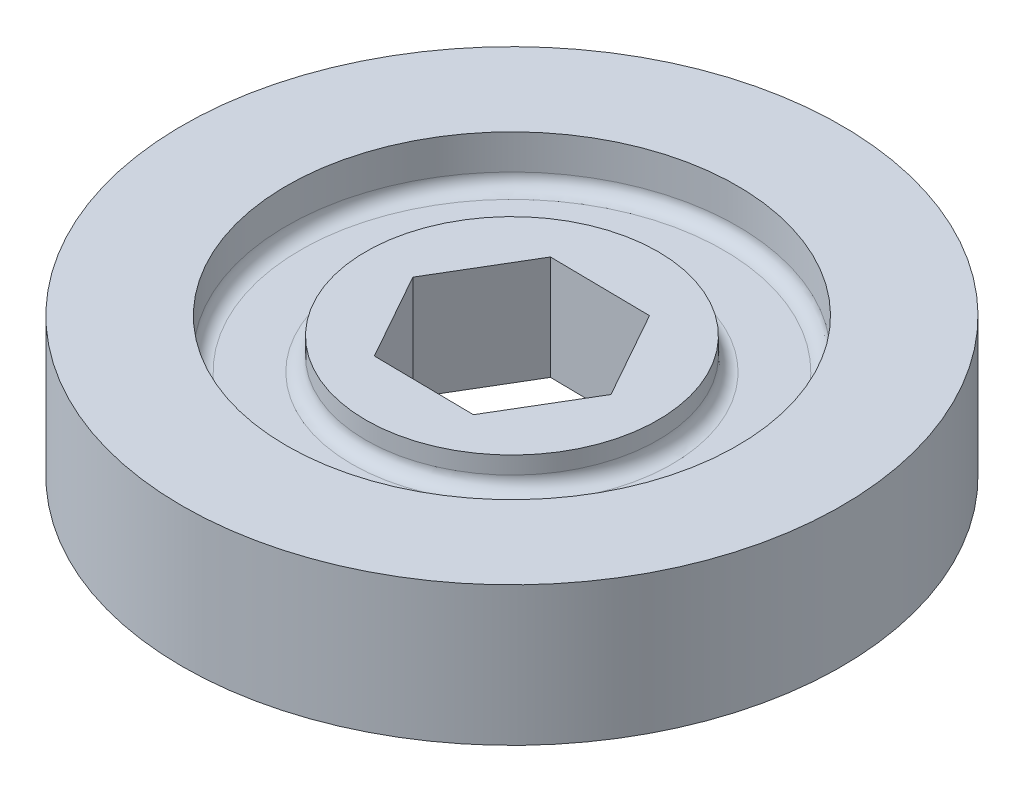
ISO-10303-21;
HEADER;
FILE_DESCRIPTION(('STEP AP214'),'2;1');
FILE_NAME('part.step','',(''),(''),'','','');
FILE_SCHEMA(('AUTOMOTIVE_DESIGN { 1 0 10303 214 1 1 1 1 }'));
ENDSEC;
DATA;
#1=APPLICATION_CONTEXT('core data for automotive mechanical design processes');
#2=APPLICATION_PROTOCOL_DEFINITION('international standard','automotive_design',2000,#1);
#3=PRODUCT_CONTEXT('',#1,'mechanical');
#4=PRODUCT('Part','Part','',(#3));
#5=PRODUCT_RELATED_PRODUCT_CATEGORY('part','',(#4));
#6=PRODUCT_DEFINITION_FORMATION('','',#4);
#7=PRODUCT_DEFINITION_CONTEXT('part definition',#1,'design');
#8=PRODUCT_DEFINITION('design','',#6,#7);
#9=PRODUCT_DEFINITION_SHAPE('','',#8);
#10=(LENGTH_UNIT() NAMED_UNIT(*) SI_UNIT(.MILLI.,.METRE.));
#11=(NAMED_UNIT(*) PLANE_ANGLE_UNIT() SI_UNIT($,.RADIAN.));
#12=(NAMED_UNIT(*) SI_UNIT($,.STERADIAN.) SOLID_ANGLE_UNIT());
#13=UNCERTAINTY_MEASURE_WITH_UNIT(LENGTH_MEASURE(1.E-05),#10,'distance_accuracy_value','');
#14=(GEOMETRIC_REPRESENTATION_CONTEXT(3) GLOBAL_UNCERTAINTY_ASSIGNED_CONTEXT((#13)) GLOBAL_UNIT_ASSIGNED_CONTEXT((#10,
#11,#12)) REPRESENTATION_CONTEXT('',''));
#15=CARTESIAN_POINT('',(0.,0.,0.));
#16=DIRECTION('',(0.,0.,1.));
#17=DIRECTION('',(1.,0.,0.));
#18=AXIS2_PLACEMENT_3D('',#15,#16,#17);
#19=CARTESIAN_POINT('',(0.,10.,0.));
#20=DIRECTION('',(0.,-1.,0.));
#21=DIRECTION('',(0.,0.,-1.));
#22=AXIS2_PLACEMENT_3D('',#19,#20,#21);
#23=CYLINDRICAL_SURFACE('',#22,23.7);
#24=CARTESIAN_POINT('',(0.,10.,0.));
#25=DIRECTION('',(0.,1.,0.));
#26=DIRECTION('',(0.,0.,1.));
#27=AXIS2_PLACEMENT_3D('',#24,#25,#26);
#28=CIRCLE('',#27,23.7);
#29=CARTESIAN_POINT('',(0.,10.,23.7));
#30=VERTEX_POINT('',#29);
#31=EDGE_CURVE('E128',#30,#30,#28,.T.);
#32=ORIENTED_EDGE('',*,*,#31,.F.);
#33=EDGE_LOOP('',(#32));
#34=FACE_BOUND('',#33,.T.);
#35=CARTESIAN_POINT('',(0.,0.,0.));
#36=DIRECTION('',(0.,1.,0.));
#37=DIRECTION('',(0.,0.,1.));
#38=AXIS2_PLACEMENT_3D('',#35,#36,#37);
#39=CIRCLE('',#38,23.7);
#40=CARTESIAN_POINT('',(0.,0.,23.7));
#41=VERTEX_POINT('',#40);
#42=EDGE_CURVE('E127',#41,#41,#39,.T.);
#43=ORIENTED_EDGE('',*,*,#42,.T.);
#44=EDGE_LOOP('',(#43));
#45=FACE_BOUND('',#44,.T.);
#46=ADVANCED_FACE('F33',(#34,#45),#23,.T.);
#47=CARTESIAN_POINT('',(0.,10.,0.));
#48=DIRECTION('',(0.,1.,0.));
#49=DIRECTION('',(0.,0.,1.));
#50=AXIS2_PLACEMENT_3D('',#47,#48,#49);
#51=PLANE('',#50);
#52=CARTESIAN_POINT('',(0.,10.,0.));
#53=DIRECTION('',(0.,1.,0.));
#54=DIRECTION('',(0.,0.,1.));
#55=AXIS2_PLACEMENT_3D('',#52,#53,#54);
#56=CIRCLE('',#55,16.2);
#57=CARTESIAN_POINT('',(0.,10.,16.2));
#58=VERTEX_POINT('',#57);
#59=EDGE_CURVE('E124',#58,#58,#56,.T.);
#60=ORIENTED_EDGE('',*,*,#59,.F.);
#61=EDGE_LOOP('',(#60));
#62=FACE_BOUND('',#61,.T.);
#63=ORIENTED_EDGE('',*,*,#31,.T.);
#64=EDGE_LOOP('',(#63));
#65=FACE_BOUND('',#64,.T.);
#66=ADVANCED_FACE('F177',(#62,#65),#51,.T.);
#67=CARTESIAN_POINT('',(0.,0.,0.));
#68=DIRECTION('',(0.,1.,0.));
#69=DIRECTION('',(0.,0.,1.));
#70=AXIS2_PLACEMENT_3D('',#67,#68,#69);
#71=PLANE('',#70);
#72=CARTESIAN_POINT('',(0.,0.,0.));
#73=DIRECTION('',(0.,-1.,0.));
#74=DIRECTION('',(0.,0.,-1.));
#75=AXIS2_PLACEMENT_3D('',#72,#73,#74);
#76=CIRCLE('',#75,16.2);
#77=CARTESIAN_POINT('',(0.,0.,-16.2));
#78=VERTEX_POINT('',#77);
#79=EDGE_CURVE('E121',#78,#78,#76,.T.);
#80=ORIENTED_EDGE('',*,*,#79,.F.);
#81=EDGE_LOOP('',(#80));
#82=FACE_BOUND('',#81,.T.);
#83=ORIENTED_EDGE('',*,*,#42,.F.);
#84=EDGE_LOOP('',(#83));
#85=FACE_BOUND('',#84,.T.);
#86=ADVANCED_FACE('F183',(#82,#85),#71,.F.);
#87=CARTESIAN_POINT('',(0.,6.5,0.));
#88=DIRECTION('',(0.,1.,0.));
#89=DIRECTION('',(0.,0.,1.));
#90=AXIS2_PLACEMENT_3D('',#87,#88,#89);
#91=CYLINDRICAL_SURFACE('',#90,16.2);
#92=CARTESIAN_POINT('',(0.,7.5,0.));
#93=DIRECTION('',(0.,1.,0.));
#94=DIRECTION('',(0.,0.,1.));
#95=AXIS2_PLACEMENT_3D('',#92,#93,#94);
#96=CIRCLE('',#95,16.2);
#97=CARTESIAN_POINT('',(0.,7.5,16.2));
#98=VERTEX_POINT('',#97);
#99=EDGE_CURVE('E153',#98,#98,#96,.F.);
#100=ORIENTED_EDGE('',*,*,#99,.T.);
#101=EDGE_LOOP('',(#100));
#102=FACE_BOUND('',#101,.T.);
#103=ORIENTED_EDGE('',*,*,#59,.T.);
#104=EDGE_LOOP('',(#103));
#105=FACE_BOUND('',#104,.T.);
#106=ADVANCED_FACE('F205',(#102,#105),#91,.F.);
#107=CARTESIAN_POINT('',(0.,6.5,0.));
#108=DIRECTION('',(0.,1.,0.));
#109=DIRECTION('',(0.,0.,1.));
#110=AXIS2_PLACEMENT_3D('',#107,#108,#109);
#111=PLANE('',#110);
#112=CARTESIAN_POINT('',(0.,6.5,0.));
#113=DIRECTION('',(0.,1.,0.));
#114=DIRECTION('',(0.,0.,1.));
#115=AXIS2_PLACEMENT_3D('',#112,#113,#114);
#116=CIRCLE('',#115,11.5);
#117=CARTESIAN_POINT('',(0.,6.5,11.5));
#118=VERTEX_POINT('',#117);
#119=EDGE_CURVE('E11',#118,#118,#116,.F.);
#120=ORIENTED_EDGE('',*,*,#119,.T.);
#121=EDGE_LOOP('',(#120));
#122=FACE_BOUND('',#121,.T.);
#123=CARTESIAN_POINT('',(0.,6.5,0.));
#124=DIRECTION('',(0.,1.,0.));
#125=DIRECTION('',(0.,0.,1.));
#126=AXIS2_PLACEMENT_3D('',#123,#124,#125);
#127=CIRCLE('',#126,15.2);
#128=CARTESIAN_POINT('',(0.,6.5,15.2));
#129=VERTEX_POINT('',#128);
#130=EDGE_CURVE('E150',#129,#129,#127,.T.);
#131=ORIENTED_EDGE('',*,*,#130,.T.);
#132=EDGE_LOOP('',(#131));
#133=FACE_BOUND('',#132,.T.);
#134=ADVANCED_FACE('F202',(#122,#133),#111,.T.);
#135=CARTESIAN_POINT('',(0.,3.5,0.));
#136=DIRECTION('',(0.,-1.,0.));
#137=DIRECTION('',(0.,0.,-1.));
#138=AXIS2_PLACEMENT_3D('',#135,#136,#137);
#139=CYLINDRICAL_SURFACE('',#138,16.2);
#140=CARTESIAN_POINT('',(0.,2.5,0.));
#141=DIRECTION('',(0.,-1.,0.));
#142=DIRECTION('',(0.,0.,-1.));
#143=AXIS2_PLACEMENT_3D('',#140,#141,#142);
#144=CIRCLE('',#143,16.2);
#145=CARTESIAN_POINT('',(0.,2.5,-16.2));
#146=VERTEX_POINT('',#145);
#147=EDGE_CURVE('E147',#146,#146,#144,.F.);
#148=ORIENTED_EDGE('',*,*,#147,.T.);
#149=EDGE_LOOP('',(#148));
#150=FACE_BOUND('',#149,.T.);
#151=ORIENTED_EDGE('',*,*,#79,.T.);
#152=EDGE_LOOP('',(#151));
#153=FACE_BOUND('',#152,.T.);
#154=ADVANCED_FACE('F204',(#150,#153),#139,.F.);
#155=CARTESIAN_POINT('',(0.,3.5,0.));
#156=DIRECTION('',(0.,-1.,0.));
#157=DIRECTION('',(0.,0.,-1.));
#158=AXIS2_PLACEMENT_3D('',#155,#156,#157);
#159=PLANE('',#158);
#160=CARTESIAN_POINT('',(0.,3.5,0.));
#161=DIRECTION('',(0.,-1.,0.));
#162=DIRECTION('',(0.,0.,-1.));
#163=AXIS2_PLACEMENT_3D('',#160,#161,#162);
#164=CIRCLE('',#163,11.5);
#165=CARTESIAN_POINT('',(0.,3.5,-11.5));
#166=VERTEX_POINT('',#165);
#167=EDGE_CURVE('E159',#166,#166,#164,.F.);
#168=ORIENTED_EDGE('',*,*,#167,.T.);
#169=EDGE_LOOP('',(#168));
#170=FACE_BOUND('',#169,.T.);
#171=CARTESIAN_POINT('',(0.,3.5,0.));
#172=DIRECTION('',(0.,-1.,0.));
#173=DIRECTION('',(0.,0.,-1.));
#174=AXIS2_PLACEMENT_3D('',#171,#172,#173);
#175=CIRCLE('',#174,15.2);
#176=CARTESIAN_POINT('',(0.,3.5,-15.2));
#177=VERTEX_POINT('',#176);
#178=EDGE_CURVE('E144',#177,#177,#175,.T.);
#179=ORIENTED_EDGE('',*,*,#178,.T.);
#180=EDGE_LOOP('',(#179));
#181=FACE_BOUND('',#180,.T.);
#182=ADVANCED_FACE('F212',(#170,#181),#159,.T.);
#183=CARTESIAN_POINT('',(0.,8.75,0.));
#184=DIRECTION('',(0.,-1.,0.));
#185=DIRECTION('',(0.,0.,-1.));
#186=AXIS2_PLACEMENT_3D('',#183,#184,#185);
#187=CYLINDRICAL_SURFACE('',#186,10.5);
#188=CARTESIAN_POINT('',(0.,7.5,0.));
#189=DIRECTION('',(0.,1.,0.));
#190=DIRECTION('',(0.,0.,1.));
#191=AXIS2_PLACEMENT_3D('',#188,#189,#190);
#192=CIRCLE('',#191,10.5);
#193=CARTESIAN_POINT('',(0.,7.5,10.5));
#194=VERTEX_POINT('',#193);
#195=EDGE_CURVE('E41',#194,#194,#192,.T.);
#196=ORIENTED_EDGE('',*,*,#195,.T.);
#197=EDGE_LOOP('',(#196));
#198=FACE_BOUND('',#197,.T.);
#199=CARTESIAN_POINT('',(0.,8.75,0.));
#200=DIRECTION('',(0.,1.,0.));
#201=DIRECTION('',(0.,0.,1.));
#202=AXIS2_PLACEMENT_3D('',#199,#200,#201);
#203=CIRCLE('',#202,10.5);
#204=CARTESIAN_POINT('',(0.,8.75,10.5));
#205=VERTEX_POINT('',#204);
#206=EDGE_CURVE('E118',#205,#205,#203,.T.);
#207=ORIENTED_EDGE('',*,*,#206,.F.);
#208=EDGE_LOOP('',(#207));
#209=FACE_BOUND('',#208,.T.);
#210=ADVANCED_FACE('F164',(#198,#209),#187,.T.);
#211=CARTESIAN_POINT('',(0.,8.75,0.));
#212=DIRECTION('',(0.,1.,0.));
#213=DIRECTION('',(0.,0.,1.));
#214=AXIS2_PLACEMENT_3D('',#211,#212,#213);
#215=PLANE('',#214);
#216=DIRECTION('',(-0.48866357112851,0.,-0.872472299991199));
#217=VECTOR('',#216,1.);
#218=CARTESIAN_POINT('',(5.45295187494499,8.75,-3.05414731955318));
#219=LINE('',#218,#217);
#220=CARTESIAN_POINT('',(7.2162646520338,8.75,0.0941159133243871));
#221=VERTEX_POINT('',#220);
#222=CARTESIAN_POINT('',(3.68963909785619,8.75,-6.20241055243075));
#223=VERTEX_POINT('',#222);
#224=EDGE_CURVE('E113',#221,#223,#219,.T.);
#225=ORIENTED_EDGE('',*,*,#224,.F.);
#226=DIRECTION('',(0.511251390326361,0.,-0.859431216496913));
#227=VECTOR('',#226,1.);
#228=CARTESIAN_POINT('',(5.3714451031057,8.75,3.19532118953976));
#229=LINE('',#228,#227);
#230=CARTESIAN_POINT('',(3.52662555417761,8.75,6.29652646575513));
#231=VERTEX_POINT('',#230);
#232=EDGE_CURVE('E111',#231,#221,#229,.T.);
#233=ORIENTED_EDGE('',*,*,#232,.F.);
#234=DIRECTION('',(0.99991496145487,0.,0.0130410834942862));
#235=VECTOR('',#234,1.);
#236=CARTESIAN_POINT('',(-0.081506771839289,8.75,6.24946850909294));
#237=LINE('',#236,#235);
#238=CARTESIAN_POINT('',(-3.68963909785619,8.75,6.20241055243075));
#239=VERTEX_POINT('',#238);
#240=EDGE_CURVE('E106',#239,#231,#237,.T.);
#241=ORIENTED_EDGE('',*,*,#240,.F.);
#242=DIRECTION('',(0.488663571128509,0.,0.872472299991199));
#243=VECTOR('',#242,1.);
#244=CARTESIAN_POINT('',(-5.45295187494499,8.75,3.05414731955318));
#245=LINE('',#244,#243);
#246=CARTESIAN_POINT('',(-7.2162646520338,8.75,-0.0941159133243836));
#247=VERTEX_POINT('',#246);
#248=EDGE_CURVE('E104',#247,#239,#245,.T.);
#249=ORIENTED_EDGE('',*,*,#248,.F.);
#250=DIRECTION('',(-0.511251390326361,0.,0.859431216496913));
#251=VECTOR('',#250,1.);
#252=CARTESIAN_POINT('',(-5.3714451031057,8.75,-3.19532118953976));
#253=LINE('',#252,#251);
#254=CARTESIAN_POINT('',(-3.52662555417761,8.75,-6.29652646575513));
#255=VERTEX_POINT('',#254);
#256=EDGE_CURVE('E88',#255,#247,#253,.T.);
#257=ORIENTED_EDGE('',*,*,#256,.F.);
#258=DIRECTION('',(-0.99991496145487,0.,-0.0130410834942866));
#259=VECTOR('',#258,1.);
#260=CARTESIAN_POINT('',(0.0815067718392913,8.75,-6.24946850909294));
#261=LINE('',#260,#259);
#262=EDGE_CURVE('E83',#223,#255,#261,.T.);
#263=ORIENTED_EDGE('',*,*,#262,.F.);
#264=EDGE_LOOP('',(#225,#233,#241,#249,#257,#263));
#265=FACE_BOUND('',#264,.T.);
#266=ORIENTED_EDGE('',*,*,#206,.T.);
#267=EDGE_LOOP('',(#266));
#268=FACE_BOUND('',#267,.T.);
#269=ADVANCED_FACE('F101',(#265,#268),#215,.T.);
#270=CARTESIAN_POINT('',(0.,1.25,0.));
#271=DIRECTION('',(0.,1.,0.));
#272=DIRECTION('',(0.,0.,1.));
#273=AXIS2_PLACEMENT_3D('',#270,#271,#272);
#274=CYLINDRICAL_SURFACE('',#273,10.5);
#275=CARTESIAN_POINT('',(0.,2.5,0.));
#276=DIRECTION('',(0.,-1.,0.));
#277=DIRECTION('',(0.,0.,-1.));
#278=AXIS2_PLACEMENT_3D('',#275,#276,#277);
#279=CIRCLE('',#278,10.5);
#280=CARTESIAN_POINT('',(0.,2.5,-10.5));
#281=VERTEX_POINT('',#280);
#282=EDGE_CURVE('E156',#281,#281,#279,.T.);
#283=ORIENTED_EDGE('',*,*,#282,.T.);
#284=EDGE_LOOP('',(#283));
#285=FACE_BOUND('',#284,.T.);
#286=CARTESIAN_POINT('',(0.,1.25,0.));
#287=DIRECTION('',(0.,-1.,0.));
#288=DIRECTION('',(0.,0.,-1.));
#289=AXIS2_PLACEMENT_3D('',#286,#287,#288);
#290=CIRCLE('',#289,10.5);
#291=CARTESIAN_POINT('',(0.,1.25,-10.5));
#292=VERTEX_POINT('',#291);
#293=EDGE_CURVE('E115',#292,#292,#290,.T.);
#294=ORIENTED_EDGE('',*,*,#293,.F.);
#295=EDGE_LOOP('',(#294));
#296=FACE_BOUND('',#295,.T.);
#297=ADVANCED_FACE('F225',(#285,#296),#274,.T.);
#298=CARTESIAN_POINT('',(0.,1.25,0.));
#299=DIRECTION('',(0.,-1.,0.));
#300=DIRECTION('',(0.,0.,-1.));
#301=AXIS2_PLACEMENT_3D('',#298,#299,#300);
#302=PLANE('',#301);
#303=DIRECTION('',(0.48866357112851,0.,0.872472299991199));
#304=VECTOR('',#303,1.);
#305=CARTESIAN_POINT('',(5.45295187494499,1.25,-3.05414731955318));
#306=LINE('',#305,#304);
#307=CARTESIAN_POINT('',(3.68963909785619,1.25,-6.20241055243075));
#308=VERTEX_POINT('',#307);
#309=CARTESIAN_POINT('',(7.2162646520338,1.25,0.0941159133243871));
#310=VERTEX_POINT('',#309);
#311=EDGE_CURVE('E142',#308,#310,#306,.T.);
#312=ORIENTED_EDGE('',*,*,#311,.F.);
#313=DIRECTION('',(0.99991496145487,0.,0.0130410834942866));
#314=VECTOR('',#313,1.);
#315=CARTESIAN_POINT('',(0.0815067718392913,1.25,-6.24946850909294));
#316=LINE('',#315,#314);
#317=CARTESIAN_POINT('',(-3.52662555417761,1.25,-6.29652646575513));
#318=VERTEX_POINT('',#317);
#319=EDGE_CURVE('E131',#318,#308,#316,.T.);
#320=ORIENTED_EDGE('',*,*,#319,.F.);
#321=DIRECTION('',(0.511251390326361,0.,-0.859431216496913));
#322=VECTOR('',#321,1.);
#323=CARTESIAN_POINT('',(-5.3714451031057,1.25,-3.19532118953976));
#324=LINE('',#323,#322);
#325=CARTESIAN_POINT('',(-7.2162646520338,1.25,-0.0941159133243836));
#326=VERTEX_POINT('',#325);
#327=EDGE_CURVE('E96',#326,#318,#324,.T.);
#328=ORIENTED_EDGE('',*,*,#327,.F.);
#329=DIRECTION('',(-0.488663571128509,0.,-0.872472299991199));
#330=VECTOR('',#329,1.);
#331=CARTESIAN_POINT('',(-5.45295187494499,1.25,3.05414731955318));
#332=LINE('',#331,#330);
#333=CARTESIAN_POINT('',(-3.68963909785619,1.25,6.20241055243075));
#334=VERTEX_POINT('',#333);
#335=EDGE_CURVE('E136',#334,#326,#332,.T.);
#336=ORIENTED_EDGE('',*,*,#335,.F.);
#337=DIRECTION('',(-0.99991496145487,0.,-0.0130410834942862));
#338=VECTOR('',#337,1.);
#339=CARTESIAN_POINT('',(-0.081506771839289,1.25,6.24946850909294));
#340=LINE('',#339,#338);
#341=CARTESIAN_POINT('',(3.52662555417761,1.25,6.29652646575513));
#342=VERTEX_POINT('',#341);
#343=EDGE_CURVE('E138',#342,#334,#340,.T.);
#344=ORIENTED_EDGE('',*,*,#343,.F.);
#345=DIRECTION('',(-0.511251390326361,0.,0.859431216496913));
#346=VECTOR('',#345,1.);
#347=CARTESIAN_POINT('',(5.3714451031057,1.25,3.19532118953976));
#348=LINE('',#347,#346);
#349=EDGE_CURVE('E140',#310,#342,#348,.T.);
#350=ORIENTED_EDGE('',*,*,#349,.F.);
#351=EDGE_LOOP('',(#312,#320,#328,#336,#344,#350));
#352=FACE_BOUND('',#351,.T.);
#353=ORIENTED_EDGE('',*,*,#293,.T.);
#354=EDGE_LOOP('',(#353));
#355=FACE_BOUND('',#354,.T.);
#356=ADVANCED_FACE('F228',(#352,#355),#302,.T.);
#357=CARTESIAN_POINT('',(7.2162646520338,0.,0.0941159133243871));
#358=DIRECTION('',(0.872472299991198,0.,-0.48866357112851));
#359=DIRECTION('',(-0.48866357112851,0.,-0.872472299991199));
#360=AXIS2_PLACEMENT_3D('',#357,#358,#359);
#361=PLANE('',#360);
#362=ORIENTED_EDGE('',*,*,#224,.T.);
#363=DIRECTION('',(0.,1.,0.));
#364=VECTOR('',#363,1.);
#365=CARTESIAN_POINT('',(3.68963909785619,0.,-6.20241055243075));
#366=LINE('',#365,#364);
#367=EDGE_CURVE('E48',#308,#223,#366,.T.);
#368=ORIENTED_EDGE('',*,*,#367,.F.);
#369=ORIENTED_EDGE('',*,*,#311,.T.);
#370=DIRECTION('',(0.,1.,0.));
#371=VECTOR('',#370,1.);
#372=CARTESIAN_POINT('',(7.2162646520338,0.,0.0941159133243871));
#373=LINE('',#372,#371);
#374=EDGE_CURVE('E89',#310,#221,#373,.T.);
#375=ORIENTED_EDGE('',*,*,#374,.T.);
#376=EDGE_LOOP('',(#362,#368,#369,#375));
#377=FACE_BOUND('',#376,.T.);
#378=ADVANCED_FACE('F232',(#377),#361,.F.);
#379=CARTESIAN_POINT('',(3.52662555417761,0.,6.29652646575513));
#380=DIRECTION('',(0.859431216496912,0.,0.511251390326361));
#381=DIRECTION('',(0.511251390326361,0.,-0.859431216496913));
#382=AXIS2_PLACEMENT_3D('',#379,#380,#381);
#383=PLANE('',#382);
#384=ORIENTED_EDGE('',*,*,#232,.T.);
#385=ORIENTED_EDGE('',*,*,#374,.F.);
#386=ORIENTED_EDGE('',*,*,#349,.T.);
#387=DIRECTION('',(0.,1.,0.));
#388=VECTOR('',#387,1.);
#389=CARTESIAN_POINT('',(3.52662555417761,0.,6.29652646575513));
#390=LINE('',#389,#388);
#391=EDGE_CURVE('E260',#342,#231,#390,.T.);
#392=ORIENTED_EDGE('',*,*,#391,.T.);
#393=EDGE_LOOP('',(#384,#385,#386,#392));
#394=FACE_BOUND('',#393,.T.);
#395=ADVANCED_FACE('F236',(#394),#383,.F.);
#396=CARTESIAN_POINT('',(-3.68963909785619,0.,6.20241055243075));
#397=DIRECTION('',(-0.0130410834942862,0.,0.99991496145487));
#398=DIRECTION('',(0.99991496145487,0.,0.0130410834942862));
#399=AXIS2_PLACEMENT_3D('',#396,#397,#398);
#400=PLANE('',#399);
#401=ORIENTED_EDGE('',*,*,#240,.T.);
#402=ORIENTED_EDGE('',*,*,#391,.F.);
#403=ORIENTED_EDGE('',*,*,#343,.T.);
#404=DIRECTION('',(0.,1.,0.));
#405=VECTOR('',#404,1.);
#406=CARTESIAN_POINT('',(-3.68963909785619,0.,6.20241055243075));
#407=LINE('',#406,#405);
#408=EDGE_CURVE('E263',#334,#239,#407,.T.);
#409=ORIENTED_EDGE('',*,*,#408,.T.);
#410=EDGE_LOOP('',(#401,#402,#403,#409));
#411=FACE_BOUND('',#410,.T.);
#412=ADVANCED_FACE('F245',(#411),#400,.F.);
#413=CARTESIAN_POINT('',(-7.2162646520338,0.,-0.0941159133243836));
#414=DIRECTION('',(-0.872472299991199,0.,0.488663571128509));
#415=DIRECTION('',(0.488663571128509,0.,0.872472299991199));
#416=AXIS2_PLACEMENT_3D('',#413,#414,#415);
#417=PLANE('',#416);
#418=ORIENTED_EDGE('',*,*,#248,.T.);
#419=ORIENTED_EDGE('',*,*,#408,.F.);
#420=ORIENTED_EDGE('',*,*,#335,.T.);
#421=DIRECTION('',(0.,1.,0.));
#422=VECTOR('',#421,1.);
#423=CARTESIAN_POINT('',(-7.2162646520338,0.,-0.0941159133243836));
#424=LINE('',#423,#422);
#425=EDGE_CURVE('E98',#326,#247,#424,.T.);
#426=ORIENTED_EDGE('',*,*,#425,.T.);
#427=EDGE_LOOP('',(#418,#419,#420,#426));
#428=FACE_BOUND('',#427,.T.);
#429=ADVANCED_FACE('F242',(#428),#417,.F.);
#430=CARTESIAN_POINT('',(-3.52662555417761,0.,-6.29652646575513));
#431=DIRECTION('',(-0.859431216496912,0.,-0.511251390326361));
#432=DIRECTION('',(-0.511251390326361,0.,0.859431216496913));
#433=AXIS2_PLACEMENT_3D('',#430,#431,#432);
#434=PLANE('',#433);
#435=ORIENTED_EDGE('',*,*,#256,.T.);
#436=ORIENTED_EDGE('',*,*,#425,.F.);
#437=ORIENTED_EDGE('',*,*,#327,.T.);
#438=DIRECTION('',(0.,1.,0.));
#439=VECTOR('',#438,1.);
#440=CARTESIAN_POINT('',(-3.52662555417761,0.,-6.29652646575513));
#441=LINE('',#440,#439);
#442=EDGE_CURVE('E53',#318,#255,#441,.T.);
#443=ORIENTED_EDGE('',*,*,#442,.T.);
#444=EDGE_LOOP('',(#435,#436,#437,#443));
#445=FACE_BOUND('',#444,.T.);
#446=ADVANCED_FACE('F92',(#445),#434,.F.);
#447=CARTESIAN_POINT('',(3.68963909785619,0.,-6.20241055243075));
#448=DIRECTION('',(0.0130410834942866,0.,-0.99991496145487));
#449=DIRECTION('',(-0.99991496145487,0.,-0.0130410834942866));
#450=AXIS2_PLACEMENT_3D('',#447,#448,#449);
#451=PLANE('',#450);
#452=ORIENTED_EDGE('',*,*,#262,.T.);
#453=ORIENTED_EDGE('',*,*,#442,.F.);
#454=ORIENTED_EDGE('',*,*,#319,.T.);
#455=ORIENTED_EDGE('',*,*,#367,.T.);
#456=EDGE_LOOP('',(#452,#453,#454,#455));
#457=FACE_BOUND('',#456,.T.);
#458=ADVANCED_FACE('F84',(#457),#451,.F.);
#459=CARTESIAN_POINT('',(0.,2.5,0.));
#460=DIRECTION('',(0.,-1.,0.));
#461=DIRECTION('',(0.,0.,-1.));
#462=AXIS2_PLACEMENT_3D('',#459,#460,#461);
#463=TOROIDAL_SURFACE('',#462,15.2,1.);
#464=ORIENTED_EDGE('',*,*,#147,.F.);
#465=EDGE_LOOP('',(#464));
#466=FACE_BOUND('',#465,.T.);
#467=ORIENTED_EDGE('',*,*,#178,.F.);
#468=EDGE_LOOP('',(#467));
#469=FACE_BOUND('',#468,.T.);
#470=ADVANCED_FACE('F190',(#466,#469),#463,.F.);
#471=CARTESIAN_POINT('',(0.,7.5,0.));
#472=DIRECTION('',(0.,1.,0.));
#473=DIRECTION('',(0.,0.,1.));
#474=AXIS2_PLACEMENT_3D('',#471,#472,#473);
#475=TOROIDAL_SURFACE('',#474,15.2,1.);
#476=ORIENTED_EDGE('',*,*,#99,.F.);
#477=EDGE_LOOP('',(#476));
#478=FACE_BOUND('',#477,.T.);
#479=ORIENTED_EDGE('',*,*,#130,.F.);
#480=EDGE_LOOP('',(#479));
#481=FACE_BOUND('',#480,.T.);
#482=ADVANCED_FACE('F173',(#478,#481),#475,.F.);
#483=CARTESIAN_POINT('',(0.,2.5,0.));
#484=DIRECTION('',(0.,-1.,0.));
#485=DIRECTION('',(0.,0.,-1.));
#486=AXIS2_PLACEMENT_3D('',#483,#484,#485);
#487=TOROIDAL_SURFACE('',#486,11.5,1.);
#488=ORIENTED_EDGE('',*,*,#167,.F.);
#489=EDGE_LOOP('',(#488));
#490=FACE_BOUND('',#489,.T.);
#491=ORIENTED_EDGE('',*,*,#282,.F.);
#492=EDGE_LOOP('',(#491));
#493=FACE_BOUND('',#492,.T.);
#494=ADVANCED_FACE('F168',(#490,#493),#487,.F.);
#495=CARTESIAN_POINT('',(0.,7.5,0.));
#496=DIRECTION('',(0.,1.,0.));
#497=DIRECTION('',(0.,0.,1.));
#498=AXIS2_PLACEMENT_3D('',#495,#496,#497);
#499=TOROIDAL_SURFACE('',#498,11.5,1.);
#500=ORIENTED_EDGE('',*,*,#119,.F.);
#501=EDGE_LOOP('',(#500));
#502=FACE_BOUND('',#501,.T.);
#503=ORIENTED_EDGE('',*,*,#195,.F.);
#504=EDGE_LOOP('',(#503));
#505=FACE_BOUND('',#504,.T.);
#506=ADVANCED_FACE('F35',(#502,#505),#499,.F.);
#507=CLOSED_SHELL('',(#46,#66,#86,#106,#134,#154,#182,#210,#269,#297,#356,#378,#395,#412,#429,
#446,#458,#470,#482,#494,#506));
#508=MANIFOLD_SOLID_BREP('B2',#507);
#509=ADVANCED_BREP_SHAPE_REPRESENTATION('',(#18,#508),#14);
#510=SHAPE_DEFINITION_REPRESENTATION(#9,#509);
ENDSEC;
END-ISO-10303-21;
